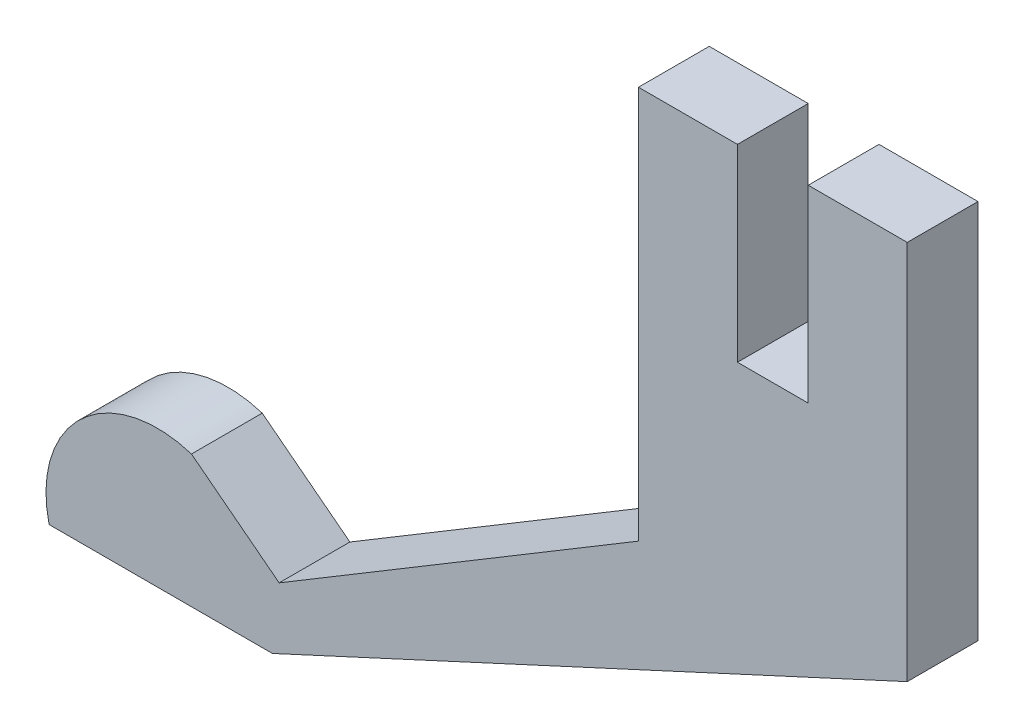
ISO-10303-21;
HEADER;
FILE_DESCRIPTION(('STEP AP214'),'2;1');
FILE_NAME('part.step','',(''),(''),'','','');
FILE_SCHEMA(('AUTOMOTIVE_DESIGN { 1 0 10303 214 1 1 1 1 }'));
ENDSEC;
DATA;
#1=APPLICATION_CONTEXT('core data for automotive mechanical design processes');
#2=APPLICATION_PROTOCOL_DEFINITION('international standard','automotive_design',2000,#1);
#3=PRODUCT_CONTEXT('',#1,'mechanical');
#4=PRODUCT('Part','Part','',(#3));
#5=PRODUCT_RELATED_PRODUCT_CATEGORY('part','',(#4));
#6=PRODUCT_DEFINITION_FORMATION('','',#4);
#7=PRODUCT_DEFINITION_CONTEXT('part definition',#1,'design');
#8=PRODUCT_DEFINITION('design','',#6,#7);
#9=PRODUCT_DEFINITION_SHAPE('','',#8);
#10=(LENGTH_UNIT() NAMED_UNIT(*) SI_UNIT(.MILLI.,.METRE.));
#11=(NAMED_UNIT(*) PLANE_ANGLE_UNIT() SI_UNIT($,.RADIAN.));
#12=(NAMED_UNIT(*) SI_UNIT($,.STERADIAN.) SOLID_ANGLE_UNIT());
#13=UNCERTAINTY_MEASURE_WITH_UNIT(LENGTH_MEASURE(1.E-05),#10,'distance_accuracy_value','');
#14=(GEOMETRIC_REPRESENTATION_CONTEXT(3) GLOBAL_UNCERTAINTY_ASSIGNED_CONTEXT((#13)) GLOBAL_UNIT_ASSIGNED_CONTEXT((#10,
#11,#12)) REPRESENTATION_CONTEXT('',''));
#15=CARTESIAN_POINT('',(0.,0.,0.));
#16=DIRECTION('',(0.,0.,1.));
#17=DIRECTION('',(1.,0.,0.));
#18=AXIS2_PLACEMENT_3D('',#15,#16,#17);
#19=CARTESIAN_POINT('',(676.26056060996,52.260266596425,3.));
#20=DIRECTION('',(1.,0.,0.));
#21=DIRECTION('',(0.,0.,-1.));
#22=AXIS2_PLACEMENT_3D('',#19,#20,#21);
#23=PLANE('',#22);
#24=DIRECTION('',(0.,-1.,0.));
#25=VECTOR('',#24,1.);
#26=CARTESIAN_POINT('',(676.26056060996,52.260266596425,0.));
#27=LINE('',#26,#25);
#28=CARTESIAN_POINT('',(676.26056060996,60.260266596425,0.));
#29=VERTEX_POINT('',#28);
#30=CARTESIAN_POINT('',(676.26056060996,52.260266596425,0.));
#31=VERTEX_POINT('',#30);
#32=EDGE_CURVE('E124',#29,#31,#27,.T.);
#33=ORIENTED_EDGE('',*,*,#32,.T.);
#34=DIRECTION('',(0.,0.,-1.));
#35=VECTOR('',#34,1.);
#36=CARTESIAN_POINT('',(676.26056060996,52.260266596425,3.));
#37=LINE('',#36,#35);
#38=CARTESIAN_POINT('',(676.26056060996,52.260266596425,3.));
#39=VERTEX_POINT('',#38);
#40=EDGE_CURVE('E11',#39,#31,#37,.T.);
#41=ORIENTED_EDGE('',*,*,#40,.F.);
#42=DIRECTION('',(0.,-1.,0.));
#43=VECTOR('',#42,1.);
#44=CARTESIAN_POINT('',(676.26056060996,52.260266596425,3.));
#45=LINE('',#44,#43);
#46=CARTESIAN_POINT('',(676.26056060996,60.260266596425,3.));
#47=VERTEX_POINT('',#46);
#48=EDGE_CURVE('E159',#47,#39,#45,.T.);
#49=ORIENTED_EDGE('',*,*,#48,.F.);
#50=DIRECTION('',(0.,0.,-1.));
#51=VECTOR('',#50,1.);
#52=CARTESIAN_POINT('',(676.26056060996,60.260266596425,3.));
#53=LINE('',#52,#51);
#54=EDGE_CURVE('E137',#47,#29,#53,.T.);
#55=ORIENTED_EDGE('',*,*,#54,.T.);
#56=EDGE_LOOP('',(#33,#41,#49,#55));
#57=FACE_BOUND('',#56,.T.);
#58=ADVANCED_FACE('F32',(#57),#23,.F.);
#59=CARTESIAN_POINT('',(673.26056060996,52.260266596425,3.));
#60=DIRECTION('',(0.,-1.,0.));
#61=DIRECTION('',(0.,0.,-1.));
#62=AXIS2_PLACEMENT_3D('',#59,#60,#61);
#63=PLANE('',#62);
#64=DIRECTION('',(-1.,0.,0.));
#65=VECTOR('',#64,1.);
#66=CARTESIAN_POINT('',(673.26056060996,52.260266596425,0.));
#67=LINE('',#66,#65);
#68=CARTESIAN_POINT('',(673.26056060996,52.260266596425,0.));
#69=VERTEX_POINT('',#68);
#70=EDGE_CURVE('E120',#31,#69,#67,.T.);
#71=ORIENTED_EDGE('',*,*,#70,.T.);
#72=DIRECTION('',(0.,0.,-1.));
#73=VECTOR('',#72,1.);
#74=CARTESIAN_POINT('',(673.26056060996,52.260266596425,3.));
#75=LINE('',#74,#73);
#76=CARTESIAN_POINT('',(673.26056060996,52.260266596425,3.));
#77=VERTEX_POINT('',#76);
#78=EDGE_CURVE('E39',#77,#69,#75,.T.);
#79=ORIENTED_EDGE('',*,*,#78,.F.);
#80=DIRECTION('',(-1.,0.,0.));
#81=VECTOR('',#80,1.);
#82=CARTESIAN_POINT('',(673.26056060996,52.260266596425,3.));
#83=LINE('',#82,#81);
#84=EDGE_CURVE('E133',#39,#77,#83,.T.);
#85=ORIENTED_EDGE('',*,*,#84,.F.);
#86=ORIENTED_EDGE('',*,*,#40,.T.);
#87=EDGE_LOOP('',(#71,#79,#85,#86));
#88=FACE_BOUND('',#87,.T.);
#89=ADVANCED_FACE('F132',(#88),#63,.F.);
#90=CARTESIAN_POINT('',(673.26056060996,60.260266596425,3.));
#91=DIRECTION('',(-1.,0.,0.));
#92=DIRECTION('',(0.,0.,1.));
#93=AXIS2_PLACEMENT_3D('',#90,#91,#92);
#94=PLANE('',#93);
#95=DIRECTION('',(0.,1.,0.));
#96=VECTOR('',#95,1.);
#97=CARTESIAN_POINT('',(673.26056060996,60.260266596425,0.));
#98=LINE('',#97,#96);
#99=CARTESIAN_POINT('',(673.26056060996,60.260266596425,0.));
#100=VERTEX_POINT('',#99);
#101=EDGE_CURVE('E126',#69,#100,#98,.T.);
#102=ORIENTED_EDGE('',*,*,#101,.T.);
#103=DIRECTION('',(0.,0.,-1.));
#104=VECTOR('',#103,1.);
#105=CARTESIAN_POINT('',(673.26056060996,60.260266596425,3.));
#106=LINE('',#105,#104);
#107=CARTESIAN_POINT('',(673.26056060996,60.260266596425,3.));
#108=VERTEX_POINT('',#107);
#109=EDGE_CURVE('E205',#108,#100,#106,.T.);
#110=ORIENTED_EDGE('',*,*,#109,.F.);
#111=DIRECTION('',(0.,1.,0.));
#112=VECTOR('',#111,1.);
#113=CARTESIAN_POINT('',(673.26056060996,60.260266596425,3.));
#114=LINE('',#113,#112);
#115=EDGE_CURVE('E162',#77,#108,#114,.T.);
#116=ORIENTED_EDGE('',*,*,#115,.F.);
#117=ORIENTED_EDGE('',*,*,#78,.T.);
#118=EDGE_LOOP('',(#102,#110,#116,#117));
#119=FACE_BOUND('',#118,.T.);
#120=ADVANCED_FACE('F209',(#119),#94,.F.);
#121=CARTESIAN_POINT('',(673.26056060996,60.260266596425,3.));
#122=DIRECTION('',(0.,-1.,0.));
#123=DIRECTION('',(0.,0.,-1.));
#124=AXIS2_PLACEMENT_3D('',#121,#122,#123);
#125=PLANE('',#124);
#126=DIRECTION('',(-1.,0.,0.));
#127=VECTOR('',#126,1.);
#128=CARTESIAN_POINT('',(673.26056060996,60.260266596425,0.));
#129=LINE('',#128,#127);
#130=CARTESIAN_POINT('',(669.06349518296,60.260266596425,0.));
#131=VERTEX_POINT('',#130);
#132=EDGE_CURVE('E141',#100,#131,#129,.T.);
#133=ORIENTED_EDGE('',*,*,#132,.T.);
#134=DIRECTION('',(0.,0.,-1.));
#135=VECTOR('',#134,1.);
#136=CARTESIAN_POINT('',(669.06349518296,60.260266596425,3.));
#137=LINE('',#136,#135);
#138=CARTESIAN_POINT('',(669.06349518296,60.260266596425,3.));
#139=VERTEX_POINT('',#138);
#140=EDGE_CURVE('E202',#139,#131,#137,.T.);
#141=ORIENTED_EDGE('',*,*,#140,.F.);
#142=DIRECTION('',(-1.,0.,0.));
#143=VECTOR('',#142,1.);
#144=CARTESIAN_POINT('',(673.26056060996,60.260266596425,3.));
#145=LINE('',#144,#143);
#146=EDGE_CURVE('E164',#108,#139,#145,.T.);
#147=ORIENTED_EDGE('',*,*,#146,.F.);
#148=ORIENTED_EDGE('',*,*,#109,.T.);
#149=EDGE_LOOP('',(#133,#141,#147,#148));
#150=FACE_BOUND('',#149,.T.);
#151=ADVANCED_FACE('F217',(#150),#125,.F.);
#152=CARTESIAN_POINT('',(669.06349518296,60.260266596425,3.));
#153=DIRECTION('',(1.,0.,0.));
#154=DIRECTION('',(0.,0.,-1.));
#155=AXIS2_PLACEMENT_3D('',#152,#153,#154);
#156=PLANE('',#155);
#157=DIRECTION('',(0.,-1.,0.));
#158=VECTOR('',#157,1.);
#159=CARTESIAN_POINT('',(669.06349518296,60.260266596425,0.));
#160=LINE('',#159,#158);
#161=CARTESIAN_POINT('',(669.06349518296,43.5948252410427,0.));
#162=VERTEX_POINT('',#161);
#163=EDGE_CURVE('E143',#131,#162,#160,.T.);
#164=ORIENTED_EDGE('',*,*,#163,.T.);
#165=DIRECTION('',(0.,0.,-1.));
#166=VECTOR('',#165,1.);
#167=CARTESIAN_POINT('',(669.06349518296,43.5948252410427,3.));
#168=LINE('',#167,#166);
#169=CARTESIAN_POINT('',(669.06349518296,43.5948252410427,3.));
#170=VERTEX_POINT('',#169);
#171=EDGE_CURVE('E199',#170,#162,#168,.T.);
#172=ORIENTED_EDGE('',*,*,#171,.F.);
#173=DIRECTION('',(0.,-1.,0.));
#174=VECTOR('',#173,1.);
#175=CARTESIAN_POINT('',(669.06349518296,60.260266596425,3.));
#176=LINE('',#175,#174);
#177=EDGE_CURVE('E166',#139,#170,#176,.T.);
#178=ORIENTED_EDGE('',*,*,#177,.F.);
#179=ORIENTED_EDGE('',*,*,#140,.T.);
#180=EDGE_LOOP('',(#164,#172,#178,#179));
#181=FACE_BOUND('',#180,.T.);
#182=ADVANCED_FACE('F220',(#181),#156,.F.);
#183=CARTESIAN_POINT('',(653.829781186263,34.4459340834352,3.));
#184=DIRECTION('',(0.514854164219953,-0.857277778544022,0.));
#185=DIRECTION('',(0.857277778544022,0.514854164219953,0.));
#186=AXIS2_PLACEMENT_3D('',#183,#184,#185);
#187=PLANE('',#186);
#188=DIRECTION('',(-0.857277778544022,-0.514854164219953,0.));
#189=VECTOR('',#188,1.);
#190=CARTESIAN_POINT('',(653.829781186263,34.4459340834352,0.));
#191=LINE('',#190,#189);
#192=CARTESIAN_POINT('',(653.829781186263,34.4459340834352,0.));
#193=VERTEX_POINT('',#192);
#194=EDGE_CURVE('E145',#162,#193,#191,.T.);
#195=ORIENTED_EDGE('',*,*,#194,.T.);
#196=DIRECTION('',(0.,0.,-1.));
#197=VECTOR('',#196,1.);
#198=CARTESIAN_POINT('',(653.829781186263,34.4459340834352,3.));
#199=LINE('',#198,#197);
#200=CARTESIAN_POINT('',(653.829781186263,34.4459340834352,3.));
#201=VERTEX_POINT('',#200);
#202=EDGE_CURVE('E196',#201,#193,#199,.T.);
#203=ORIENTED_EDGE('',*,*,#202,.F.);
#204=DIRECTION('',(-0.857277778544022,-0.514854164219953,0.));
#205=VECTOR('',#204,1.);
#206=CARTESIAN_POINT('',(653.829781186263,34.4459340834352,3.));
#207=LINE('',#206,#205);
#208=EDGE_CURVE('E168',#170,#201,#207,.T.);
#209=ORIENTED_EDGE('',*,*,#208,.F.);
#210=ORIENTED_EDGE('',*,*,#171,.T.);
#211=EDGE_LOOP('',(#195,#203,#209,#210));
#212=FACE_BOUND('',#211,.T.);
#213=ADVANCED_FACE('F225',(#212),#187,.F.);
#214=CARTESIAN_POINT('',(653.829781186263,34.4459340834352,3.));
#215=DIRECTION('',(-0.611466082535147,-0.791270642643287,0.));
#216=DIRECTION('',(0.791270642643287,-0.611466082535147,0.));
#217=AXIS2_PLACEMENT_3D('',#214,#215,#216);
#218=PLANE('',#217);
#219=DIRECTION('',(-0.791270642643287,0.611466082535147,0.));
#220=VECTOR('',#219,1.);
#221=CARTESIAN_POINT('',(653.829781186263,34.4459340834352,0.));
#222=LINE('',#221,#220);
#223=CARTESIAN_POINT('',(650.112842273349,37.3182535574774,0.));
#224=VERTEX_POINT('',#223);
#225=EDGE_CURVE('E147',#193,#224,#222,.T.);
#226=ORIENTED_EDGE('',*,*,#225,.T.);
#227=DIRECTION('',(0.,0.,-1.));
#228=VECTOR('',#227,1.);
#229=CARTESIAN_POINT('',(650.112842273349,37.3182535574774,3.));
#230=LINE('',#229,#228);
#231=CARTESIAN_POINT('',(650.112842273349,37.3182535574774,3.));
#232=VERTEX_POINT('',#231);
#233=EDGE_CURVE('E193',#232,#224,#230,.T.);
#234=ORIENTED_EDGE('',*,*,#233,.F.);
#235=DIRECTION('',(-0.791270642643287,0.611466082535147,0.));
#236=VECTOR('',#235,1.);
#237=CARTESIAN_POINT('',(653.829781186263,34.4459340834352,3.));
#238=LINE('',#237,#236);
#239=EDGE_CURVE('E170',#201,#232,#238,.T.);
#240=ORIENTED_EDGE('',*,*,#239,.F.);
#241=ORIENTED_EDGE('',*,*,#202,.T.);
#242=EDGE_LOOP('',(#226,#234,#240,#241));
#243=FACE_BOUND('',#242,.T.);
#244=ADVANCED_FACE('F231',(#243),#218,.F.);
#245=CARTESIAN_POINT('',(648.667235037667,32.823207376975,3.));
#246=DIRECTION('',(0.,0.,-1.));
#247=DIRECTION('',(-1.,0.,0.));
#248=AXIS2_PLACEMENT_3D('',#245,#246,#247);
#249=CYLINDRICAL_SURFACE('',#248,4.72178149057171);
#250=CARTESIAN_POINT('',(648.667235037667,32.823207376975,0.));
#251=DIRECTION('',(0.,0.,1.));
#252=DIRECTION('',(1.,0.,0.));
#253=AXIS2_PLACEMENT_3D('',#250,#251,#252);
#254=CIRCLE('',#253,4.72178149057171);
#255=CARTESIAN_POINT('',(644.07871305269,31.7093463272531,0.));
#256=VERTEX_POINT('',#255);
#257=EDGE_CURVE('E149',#224,#256,#254,.T.);
#258=ORIENTED_EDGE('',*,*,#257,.T.);
#259=DIRECTION('',(0.,0.,-1.));
#260=VECTOR('',#259,1.);
#261=CARTESIAN_POINT('',(644.07871305269,31.7093463272531,3.));
#262=LINE('',#261,#260);
#263=CARTESIAN_POINT('',(644.07871305269,31.7093463272531,3.));
#264=VERTEX_POINT('',#263);
#265=EDGE_CURVE('E190',#264,#256,#262,.T.);
#266=ORIENTED_EDGE('',*,*,#265,.F.);
#267=CARTESIAN_POINT('',(648.667235037667,32.823207376975,3.));
#268=DIRECTION('',(0.,0.,1.));
#269=DIRECTION('',(1.,0.,0.));
#270=AXIS2_PLACEMENT_3D('',#267,#268,#269);
#271=CIRCLE('',#270,4.72178149057171);
#272=EDGE_CURVE('E172',#232,#264,#271,.T.);
#273=ORIENTED_EDGE('',*,*,#272,.F.);
#274=ORIENTED_EDGE('',*,*,#233,.T.);
#275=EDGE_LOOP('',(#258,#266,#273,#274));
#276=FACE_BOUND('',#275,.T.);
#277=ADVANCED_FACE('F235',(#276),#249,.T.);
#278=CARTESIAN_POINT('',(653.540593645455,31.7093463272531,3.));
#279=DIRECTION('',(0.,1.,0.));
#280=DIRECTION('',(0.,0.,1.));
#281=AXIS2_PLACEMENT_3D('',#278,#279,#280);
#282=PLANE('',#281);
#283=DIRECTION('',(1.,0.,0.));
#284=VECTOR('',#283,1.);
#285=CARTESIAN_POINT('',(653.540593645455,31.7093463272531,0.));
#286=LINE('',#285,#284);
#287=CARTESIAN_POINT('',(653.540593645455,31.7093463272531,0.));
#288=VERTEX_POINT('',#287);
#289=EDGE_CURVE('E151',#256,#288,#286,.T.);
#290=ORIENTED_EDGE('',*,*,#289,.T.);
#291=DIRECTION('',(0.,0.,-1.));
#292=VECTOR('',#291,1.);
#293=CARTESIAN_POINT('',(653.540593645455,31.7093463272531,3.));
#294=LINE('',#293,#292);
#295=CARTESIAN_POINT('',(653.540593645455,31.7093463272531,3.));
#296=VERTEX_POINT('',#295);
#297=EDGE_CURVE('E187',#296,#288,#294,.T.);
#298=ORIENTED_EDGE('',*,*,#297,.F.);
#299=DIRECTION('',(1.,0.,0.));
#300=VECTOR('',#299,1.);
#301=CARTESIAN_POINT('',(653.540593645455,31.7093463272531,3.));
#302=LINE('',#301,#300);
#303=EDGE_CURVE('E174',#264,#296,#302,.T.);
#304=ORIENTED_EDGE('',*,*,#303,.F.);
#305=ORIENTED_EDGE('',*,*,#265,.T.);
#306=EDGE_LOOP('',(#290,#298,#304,#305));
#307=FACE_BOUND('',#306,.T.);
#308=ADVANCED_FACE('F240',(#307),#282,.F.);
#309=CARTESIAN_POINT('',(680.457626036961,44.1323015788439,3.));
#310=DIRECTION('',(-0.419050100046536,0.907963112494659,0.));
#311=DIRECTION('',(-0.907963112494659,-0.419050100046536,0.));
#312=AXIS2_PLACEMENT_3D('',#309,#310,#311);
#313=PLANE('',#312);
#314=DIRECTION('',(0.907963112494659,0.419050100046536,0.));
#315=VECTOR('',#314,1.);
#316=CARTESIAN_POINT('',(680.457626036961,44.1323015788439,0.));
#317=LINE('',#316,#315);
#318=CARTESIAN_POINT('',(680.457626036961,44.1323015788439,0.));
#319=VERTEX_POINT('',#318);
#320=EDGE_CURVE('E153',#288,#319,#317,.T.);
#321=ORIENTED_EDGE('',*,*,#320,.T.);
#322=DIRECTION('',(0.,0.,-1.));
#323=VECTOR('',#322,1.);
#324=CARTESIAN_POINT('',(680.457626036961,44.1323015788439,3.));
#325=LINE('',#324,#323);
#326=CARTESIAN_POINT('',(680.457626036961,44.1323015788439,3.));
#327=VERTEX_POINT('',#326);
#328=EDGE_CURVE('E184',#327,#319,#325,.T.);
#329=ORIENTED_EDGE('',*,*,#328,.F.);
#330=DIRECTION('',(0.907963112494659,0.419050100046536,0.));
#331=VECTOR('',#330,1.);
#332=CARTESIAN_POINT('',(680.457626036961,44.1323015788439,3.));
#333=LINE('',#332,#331);
#334=EDGE_CURVE('E176',#296,#327,#333,.T.);
#335=ORIENTED_EDGE('',*,*,#334,.F.);
#336=ORIENTED_EDGE('',*,*,#297,.T.);
#337=EDGE_LOOP('',(#321,#329,#335,#336));
#338=FACE_BOUND('',#337,.T.);
#339=ADVANCED_FACE('F244',(#338),#313,.F.);
#340=CARTESIAN_POINT('',(680.457626036961,44.1323015788439,3.));
#341=DIRECTION('',(-1.,0.,0.));
#342=DIRECTION('',(0.,0.,1.));
#343=AXIS2_PLACEMENT_3D('',#340,#341,#342);
#344=PLANE('',#343);
#345=DIRECTION('',(0.,1.,0.));
#346=VECTOR('',#345,1.);
#347=CARTESIAN_POINT('',(680.457626036961,44.1323015788439,0.));
#348=LINE('',#347,#346);
#349=CARTESIAN_POINT('',(680.457626036961,60.260266596425,0.));
#350=VERTEX_POINT('',#349);
#351=EDGE_CURVE('E155',#319,#350,#348,.T.);
#352=ORIENTED_EDGE('',*,*,#351,.T.);
#353=DIRECTION('',(0.,0.,-1.));
#354=VECTOR('',#353,1.);
#355=CARTESIAN_POINT('',(680.457626036961,60.260266596425,3.));
#356=LINE('',#355,#354);
#357=CARTESIAN_POINT('',(680.457626036961,60.260266596425,3.));
#358=VERTEX_POINT('',#357);
#359=EDGE_CURVE('E181',#358,#350,#356,.T.);
#360=ORIENTED_EDGE('',*,*,#359,.F.);
#361=DIRECTION('',(0.,1.,0.));
#362=VECTOR('',#361,1.);
#363=CARTESIAN_POINT('',(680.457626036961,44.1323015788439,3.));
#364=LINE('',#363,#362);
#365=EDGE_CURVE('E51',#327,#358,#364,.T.);
#366=ORIENTED_EDGE('',*,*,#365,.F.);
#367=ORIENTED_EDGE('',*,*,#328,.T.);
#368=EDGE_LOOP('',(#352,#360,#366,#367));
#369=FACE_BOUND('',#368,.T.);
#370=ADVANCED_FACE('F248',(#369),#344,.F.);
#371=CARTESIAN_POINT('',(680.457626036961,60.260266596425,3.));
#372=DIRECTION('',(0.,-1.,0.));
#373=DIRECTION('',(0.,0.,-1.));
#374=AXIS2_PLACEMENT_3D('',#371,#372,#373);
#375=PLANE('',#374);
#376=DIRECTION('',(-1.,0.,0.));
#377=VECTOR('',#376,1.);
#378=CARTESIAN_POINT('',(680.457626036961,60.260266596425,0.));
#379=LINE('',#378,#377);
#380=EDGE_CURVE('E157',#350,#29,#379,.T.);
#381=ORIENTED_EDGE('',*,*,#380,.T.);
#382=ORIENTED_EDGE('',*,*,#54,.F.);
#383=DIRECTION('',(-1.,0.,0.));
#384=VECTOR('',#383,1.);
#385=CARTESIAN_POINT('',(680.457626036961,60.260266596425,3.));
#386=LINE('',#385,#384);
#387=EDGE_CURVE('E46',#358,#47,#386,.T.);
#388=ORIENTED_EDGE('',*,*,#387,.F.);
#389=ORIENTED_EDGE('',*,*,#359,.T.);
#390=EDGE_LOOP('',(#381,#382,#388,#389));
#391=FACE_BOUND('',#390,.T.);
#392=ADVANCED_FACE('F250',(#391),#375,.F.);
#393=CARTESIAN_POINT('',(648.667235037667,32.823207376975,3.));
#394=DIRECTION('',(0.,0.,1.));
#395=DIRECTION('',(1.,0.,0.));
#396=AXIS2_PLACEMENT_3D('',#393,#394,#395);
#397=PLANE('',#396);
#398=ORIENTED_EDGE('',*,*,#48,.T.);
#399=ORIENTED_EDGE('',*,*,#84,.T.);
#400=ORIENTED_EDGE('',*,*,#115,.T.);
#401=ORIENTED_EDGE('',*,*,#146,.T.);
#402=ORIENTED_EDGE('',*,*,#177,.T.);
#403=ORIENTED_EDGE('',*,*,#208,.T.);
#404=ORIENTED_EDGE('',*,*,#239,.T.);
#405=ORIENTED_EDGE('',*,*,#272,.T.);
#406=ORIENTED_EDGE('',*,*,#303,.T.);
#407=ORIENTED_EDGE('',*,*,#334,.T.);
#408=ORIENTED_EDGE('',*,*,#365,.T.);
#409=ORIENTED_EDGE('',*,*,#387,.T.);
#410=EDGE_LOOP('',(#398,#399,#400,#401,#402,#403,#404,#405,#406,#407,#408,#409));
#411=FACE_BOUND('',#410,.T.);
#412=ADVANCED_FACE('F212',(#411),#397,.T.);
#413=CARTESIAN_POINT('',(648.667235037667,32.823207376975,0.));
#414=DIRECTION('',(0.,0.,1.));
#415=DIRECTION('',(1.,0.,0.));
#416=AXIS2_PLACEMENT_3D('',#413,#414,#415);
#417=PLANE('',#416);
#418=ORIENTED_EDGE('',*,*,#32,.F.);
#419=ORIENTED_EDGE('',*,*,#380,.F.);
#420=ORIENTED_EDGE('',*,*,#351,.F.);
#421=ORIENTED_EDGE('',*,*,#320,.F.);
#422=ORIENTED_EDGE('',*,*,#289,.F.);
#423=ORIENTED_EDGE('',*,*,#257,.F.);
#424=ORIENTED_EDGE('',*,*,#225,.F.);
#425=ORIENTED_EDGE('',*,*,#194,.F.);
#426=ORIENTED_EDGE('',*,*,#163,.F.);
#427=ORIENTED_EDGE('',*,*,#132,.F.);
#428=ORIENTED_EDGE('',*,*,#101,.F.);
#429=ORIENTED_EDGE('',*,*,#70,.F.);
#430=EDGE_LOOP('',(#418,#419,#420,#421,#422,#423,#424,#425,#426,#427,#428,#429));
#431=FACE_BOUND('',#430,.T.);
#432=ADVANCED_FACE('F121',(#431),#417,.F.);
#433=CLOSED_SHELL('',(#58,#89,#120,#151,#182,#213,#244,#277,#308,#339,#370,#392,#412,#432));
#434=MANIFOLD_SOLID_BREP('B2',#433);
#435=ADVANCED_BREP_SHAPE_REPRESENTATION('',(#18,#434),#14);
#436=SHAPE_DEFINITION_REPRESENTATION(#9,#435);
ENDSEC;
END-ISO-10303-21;
